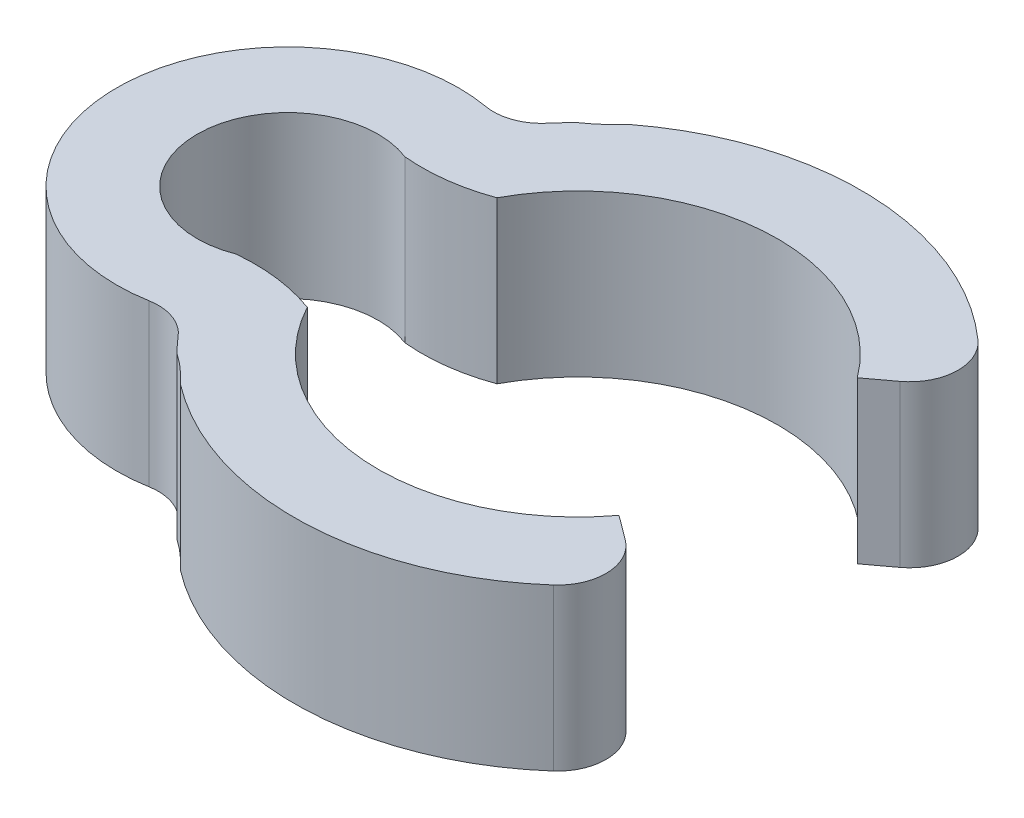
ISO-10303-21;
HEADER;
FILE_DESCRIPTION(('STEP AP214'),'2;1');
FILE_NAME('part.step','',(''),(''),'','','');
FILE_SCHEMA(('AUTOMOTIVE_DESIGN { 1 0 10303 214 1 1 1 1 }'));
ENDSEC;
DATA;
#1=APPLICATION_CONTEXT('core data for automotive mechanical design processes');
#2=APPLICATION_PROTOCOL_DEFINITION('international standard','automotive_design',2000,#1);
#3=PRODUCT_CONTEXT('',#1,'mechanical');
#4=PRODUCT('Part','Part','',(#3));
#5=PRODUCT_RELATED_PRODUCT_CATEGORY('part','',(#4));
#6=PRODUCT_DEFINITION_FORMATION('','',#4);
#7=PRODUCT_DEFINITION_CONTEXT('part definition',#1,'design');
#8=PRODUCT_DEFINITION('design','',#6,#7);
#9=PRODUCT_DEFINITION_SHAPE('','',#8);
#10=(LENGTH_UNIT() NAMED_UNIT(*) SI_UNIT(.MILLI.,.METRE.));
#11=(NAMED_UNIT(*) PLANE_ANGLE_UNIT() SI_UNIT($,.RADIAN.));
#12=(NAMED_UNIT(*) SI_UNIT($,.STERADIAN.) SOLID_ANGLE_UNIT());
#13=UNCERTAINTY_MEASURE_WITH_UNIT(LENGTH_MEASURE(1.E-05),#10,'distance_accuracy_value','');
#14=(GEOMETRIC_REPRESENTATION_CONTEXT(3) GLOBAL_UNCERTAINTY_ASSIGNED_CONTEXT((#13)) GLOBAL_UNIT_ASSIGNED_CONTEXT((#10,
#11,#12)) REPRESENTATION_CONTEXT('',''));
#15=CARTESIAN_POINT('',(0.,0.,0.));
#16=DIRECTION('',(0.,0.,1.));
#17=DIRECTION('',(1.,0.,0.));
#18=AXIS2_PLACEMENT_3D('',#15,#16,#17);
#19=CARTESIAN_POINT('',(-26.2302612035856,10.,-35.2877235474862));
#20=DIRECTION('',(-0.596566142647483,0.,-0.802563914867036));
#21=DIRECTION('',(-0.802563914867036,0.,0.596566142647483));
#22=AXIS2_PLACEMENT_3D('',#19,#20,#21);
#23=PLANE('',#22);
#24=DIRECTION('',(0.802563914867036,0.,-0.596566142647483));
#25=VECTOR('',#24,1.);
#26=CARTESIAN_POINT('',(-26.2302612035856,0.,-35.2877235474862));
#27=LINE('',#26,#25);
#28=CARTESIAN_POINT('',(-56.1272497325228,0.,-13.0645326051934));
#29=VERTEX_POINT('',#28);
#30=CARTESIAN_POINT('',(-54.6139119523254,0.,-14.1894350152458));
#31=VERTEX_POINT('',#30);
#32=EDGE_CURVE('E216',#29,#31,#27,.T.);
#33=ORIENTED_EDGE('',*,*,#32,.T.);
#34=DIRECTION('',(0.,-1.,0.));
#35=VECTOR('',#34,1.);
#36=CARTESIAN_POINT('',(-54.6139119523254,10.,-14.1894350152458));
#37=LINE('',#36,#35);
#38=CARTESIAN_POINT('',(-54.6139119523254,10.,-14.1894350152458));
#39=VERTEX_POINT('',#38);
#40=EDGE_CURVE('E59',#31,#39,#37,.F.);
#41=ORIENTED_EDGE('',*,*,#40,.T.);
#42=DIRECTION('',(0.802563914867036,0.,-0.596566142647483));
#43=VECTOR('',#42,1.);
#44=CARTESIAN_POINT('',(-26.2302612035856,10.,-35.2877235474862));
#45=LINE('',#44,#43);
#46=CARTESIAN_POINT('',(-56.1272497325228,10.,-13.0645326051934));
#47=VERTEX_POINT('',#46);
#48=EDGE_CURVE('E170',#47,#39,#45,.T.);
#49=ORIENTED_EDGE('',*,*,#48,.F.);
#50=DIRECTION('',(0.,-1.,0.));
#51=VECTOR('',#50,1.);
#52=CARTESIAN_POINT('',(-56.1272497325228,10.,-13.0645326051934));
#53=LINE('',#52,#51);
#54=EDGE_CURVE('E215',#47,#29,#53,.T.);
#55=ORIENTED_EDGE('',*,*,#54,.T.);
#56=EDGE_LOOP('',(#33,#41,#49,#55));
#57=FACE_BOUND('',#56,.T.);
#58=ADVANCED_FACE('F36',(#57),#23,.F.);
#59=CARTESIAN_POINT('',(-66.0739101359624,10.,-5.67092728705809));
#60=DIRECTION('',(0.,-1.,0.));
#61=DIRECTION('',(0.,0.,-1.));
#62=AXIS2_PLACEMENT_3D('',#59,#60,#61);
#63=CYLINDRICAL_SURFACE('',#62,17.5909743432081);
#64=CARTESIAN_POINT('',(-66.0739101359624,10.,-5.67092728705809));
#65=DIRECTION('',(0.,1.,0.));
#66=DIRECTION('',(0.,0.,1.));
#67=AXIS2_PLACEMENT_3D('',#64,#65,#66);
#68=CIRCLE('',#67,17.5909743432081);
#69=CARTESIAN_POINT('',(-54.4153333410044,10.,-18.8436250160532));
#70=VERTEX_POINT('',#69);
#71=CARTESIAN_POINT('',(-76.7955892627973,10.,-19.6168218458377));
#72=VERTEX_POINT('',#71);
#73=EDGE_CURVE('E160',#70,#72,#68,.T.);
#74=ORIENTED_EDGE('',*,*,#73,.F.);
#75=DIRECTION('',(0.,-1.,0.));
#76=VECTOR('',#75,1.);
#77=CARTESIAN_POINT('',(-54.4153333410044,10.,-18.8436250160532));
#78=LINE('',#77,#76);
#79=CARTESIAN_POINT('',(-54.4153333410044,0.,-18.8436250160532));
#80=VERTEX_POINT('',#79);
#81=EDGE_CURVE('E289',#70,#80,#78,.T.);
#82=ORIENTED_EDGE('',*,*,#81,.T.);
#83=CARTESIAN_POINT('',(-66.0739101359624,0.,-5.67092728705809));
#84=DIRECTION('',(0.,1.,0.));
#85=DIRECTION('',(0.,0.,1.));
#86=AXIS2_PLACEMENT_3D('',#83,#84,#85);
#87=CIRCLE('',#86,17.5909743432081);
#88=CARTESIAN_POINT('',(-76.7955892627973,0.,-19.6168218458377));
#89=VERTEX_POINT('',#88);
#90=EDGE_CURVE('E176',#80,#89,#87,.T.);
#91=ORIENTED_EDGE('',*,*,#90,.T.);
#92=DIRECTION('',(0.,-1.,0.));
#93=VECTOR('',#92,1.);
#94=CARTESIAN_POINT('',(-76.7955892627973,10.,-19.6168218458377));
#95=LINE('',#94,#93);
#96=EDGE_CURVE('E173',#72,#89,#95,.T.);
#97=ORIENTED_EDGE('',*,*,#96,.F.);
#98=EDGE_LOOP('',(#74,#82,#91,#97));
#99=FACE_BOUND('',#98,.T.);
#100=ADVANCED_FACE('F174',(#99),#63,.T.);
#101=CARTESIAN_POINT('',(-84.2930671877813,10.,-26.356842202746));
#102=DIRECTION('',(0.,-1.,0.));
#103=DIRECTION('',(0.,0.,-1.));
#104=AXIS2_PLACEMENT_3D('',#101,#102,#103);
#105=CYLINDRICAL_SURFACE('',#104,10.0816689911523);
#106=CARTESIAN_POINT('',(-84.2930671877813,0.,-26.356842202746));
#107=DIRECTION('',(0.,1.,0.));
#108=DIRECTION('',(0.,0.,1.));
#109=AXIS2_PLACEMENT_3D('',#106,#107,#108);
#110=CIRCLE('',#109,10.0816689911523);
#111=CARTESIAN_POINT('',(-78.5539627441667,0.,-18.0681312153581));
#112=VERTEX_POINT('',#111);
#113=EDGE_CURVE('E219',#112,#89,#110,.T.);
#114=ORIENTED_EDGE('',*,*,#113,.F.);
#115=DIRECTION('',(0.,-1.,0.));
#116=VECTOR('',#115,1.);
#117=CARTESIAN_POINT('',(-78.5539627441667,10.,-18.0681312153581));
#118=LINE('',#117,#116);
#119=CARTESIAN_POINT('',(-78.5539627441667,10.,-18.0681312153581));
#120=VERTEX_POINT('',#119);
#121=EDGE_CURVE('E181',#120,#112,#118,.T.);
#122=ORIENTED_EDGE('',*,*,#121,.F.);
#123=CARTESIAN_POINT('',(-84.2930671877813,10.,-26.356842202746));
#124=DIRECTION('',(0.,1.,0.));
#125=DIRECTION('',(0.,0.,1.));
#126=AXIS2_PLACEMENT_3D('',#123,#124,#125);
#127=CIRCLE('',#126,10.0816689911523);
#128=EDGE_CURVE('E166',#120,#72,#127,.T.);
#129=ORIENTED_EDGE('',*,*,#128,.T.);
#130=ORIENTED_EDGE('',*,*,#96,.T.);
#131=EDGE_LOOP('',(#114,#122,#129,#130));
#132=FACE_BOUND('',#131,.T.);
#133=ADVANCED_FACE('F183',(#132),#105,.F.);
#134=CARTESIAN_POINT('',(-66.0739101359624,10.,-5.67092728705809));
#135=DIRECTION('',(0.,-1.,0.));
#136=DIRECTION('',(0.,0.,-1.));
#137=AXIS2_PLACEMENT_3D('',#134,#135,#136);
#138=CYLINDRICAL_SURFACE('',#137,17.5909743432081);
#139=CARTESIAN_POINT('',(-66.0739101359624,0.,-5.67092728705809));
#140=DIRECTION('',(0.,1.,0.));
#141=DIRECTION('',(0.,0.,1.));
#142=AXIS2_PLACEMENT_3D('',#139,#140,#141);
#143=CIRCLE('',#142,17.5909743432081);
#144=CARTESIAN_POINT('',(-79.4320728722765,0.,-17.1165319741663));
#145=VERTEX_POINT('',#144);
#146=EDGE_CURVE('E221',#112,#145,#143,.T.);
#147=ORIENTED_EDGE('',*,*,#146,.T.);
#148=DIRECTION('',(0.,-1.,0.));
#149=VECTOR('',#148,1.);
#150=CARTESIAN_POINT('',(-79.4320728722765,10.,-17.1165319741663));
#151=LINE('',#150,#149);
#152=CARTESIAN_POINT('',(-79.4320728722765,10.,-17.1165319741663));
#153=VERTEX_POINT('',#152);
#154=EDGE_CURVE('E275',#145,#153,#151,.F.);
#155=ORIENTED_EDGE('',*,*,#154,.T.);
#156=CARTESIAN_POINT('',(-66.0739101359624,10.,-5.67092728705809));
#157=DIRECTION('',(0.,1.,0.));
#158=DIRECTION('',(0.,0.,1.));
#159=AXIS2_PLACEMENT_3D('',#156,#157,#158);
#160=CIRCLE('',#159,17.5909743432081);
#161=EDGE_CURVE('E185',#120,#153,#160,.T.);
#162=ORIENTED_EDGE('',*,*,#161,.F.);
#163=ORIENTED_EDGE('',*,*,#121,.T.);
#164=EDGE_LOOP('',(#147,#155,#162,#163));
#165=FACE_BOUND('',#164,.T.);
#166=ADVANCED_FACE('F303',(#165),#138,.T.);
#167=CARTESIAN_POINT('',(-84.0849290050507,10.,-5.67092728705809));
#168=DIRECTION('',(0.,-1.,0.));
#169=DIRECTION('',(0.,0.,-1.));
#170=AXIS2_PLACEMENT_3D('',#167,#168,#169);
#171=CYLINDRICAL_SURFACE('',#170,10.6063946818647);
#172=CARTESIAN_POINT('',(-84.0849290050507,0.,-5.67092728705809));
#173=DIRECTION('',(0.,1.,0.));
#174=DIRECTION('',(0.,0.,1.));
#175=AXIS2_PLACEMENT_3D('',#172,#173,#174);
#176=CIRCLE('',#175,10.6063946818647);
#177=CARTESIAN_POINT('',(-82.2337916369375,0.,-16.1145329188245));
#178=VERTEX_POINT('',#177);
#179=CARTESIAN_POINT('',(-82.2337916369375,0.,4.77267834470828));
#180=VERTEX_POINT('',#179);
#181=EDGE_CURVE('E224',#178,#180,#176,.T.);
#182=ORIENTED_EDGE('',*,*,#181,.T.);
#183=DIRECTION('',(0.,-1.,0.));
#184=VECTOR('',#183,1.);
#185=CARTESIAN_POINT('',(-82.2337916369375,10.,4.77267834470828));
#186=LINE('',#185,#184);
#187=CARTESIAN_POINT('',(-82.2337916369375,10.,4.77267834470828));
#188=VERTEX_POINT('',#187);
#189=EDGE_CURVE('E273',#180,#188,#186,.F.);
#190=ORIENTED_EDGE('',*,*,#189,.T.);
#191=CARTESIAN_POINT('',(-84.0849290050507,10.,-5.67092728705809));
#192=DIRECTION('',(0.,1.,0.));
#193=DIRECTION('',(0.,0.,1.));
#194=AXIS2_PLACEMENT_3D('',#191,#192,#193);
#195=CIRCLE('',#194,10.6063946818647);
#196=CARTESIAN_POINT('',(-82.2337916369375,10.,-16.1145329188245));
#197=VERTEX_POINT('',#196);
#198=EDGE_CURVE('E187',#197,#188,#195,.T.);
#199=ORIENTED_EDGE('',*,*,#198,.F.);
#200=DIRECTION('',(0.,-1.,0.));
#201=VECTOR('',#200,1.);
#202=CARTESIAN_POINT('',(-82.2337916369375,10.,-16.1145329188245));
#203=LINE('',#202,#201);
#204=EDGE_CURVE('E270',#197,#178,#203,.T.);
#205=ORIENTED_EDGE('',*,*,#204,.T.);
#206=EDGE_LOOP('',(#182,#190,#199,#205));
#207=FACE_BOUND('',#206,.T.);
#208=ADVANCED_FACE('F309',(#207),#171,.T.);
#209=CARTESIAN_POINT('',(-66.0739101359624,10.,-5.67092728705809));
#210=DIRECTION('',(0.,-1.,0.));
#211=DIRECTION('',(0.,0.,-1.));
#212=AXIS2_PLACEMENT_3D('',#209,#210,#211);
#213=CYLINDRICAL_SURFACE('',#212,17.5909743432081);
#214=CARTESIAN_POINT('',(-66.0739101359624,10.,-5.67092728705809));
#215=DIRECTION('',(0.,1.,0.));
#216=DIRECTION('',(0.,0.,1.));
#217=AXIS2_PLACEMENT_3D('',#214,#215,#216);
#218=CIRCLE('',#217,17.5909743432081);
#219=CARTESIAN_POINT('',(-79.4320728722765,10.,5.77467740005009));
#220=VERTEX_POINT('',#219);
#221=CARTESIAN_POINT('',(-78.5539627441668,10.,6.72627664124188));
#222=VERTEX_POINT('',#221);
#223=EDGE_CURVE('E193',#220,#222,#218,.T.);
#224=ORIENTED_EDGE('',*,*,#223,.F.);
#225=DIRECTION('',(0.,-1.,0.));
#226=VECTOR('',#225,1.);
#227=CARTESIAN_POINT('',(-79.4320728722765,10.,5.7746774000501));
#228=LINE('',#227,#226);
#229=CARTESIAN_POINT('',(-79.4320728722765,0.,5.77467740005009));
#230=VERTEX_POINT('',#229);
#231=EDGE_CURVE('E180',#220,#230,#228,.T.);
#232=ORIENTED_EDGE('',*,*,#231,.T.);
#233=CARTESIAN_POINT('',(-66.0739101359624,0.,-5.67092728705809));
#234=DIRECTION('',(0.,1.,0.));
#235=DIRECTION('',(0.,0.,1.));
#236=AXIS2_PLACEMENT_3D('',#233,#234,#235);
#237=CIRCLE('',#236,17.5909743432081);
#238=CARTESIAN_POINT('',(-78.5539627441668,0.,6.72627664124188));
#239=VERTEX_POINT('',#238);
#240=EDGE_CURVE('E227',#230,#239,#237,.T.);
#241=ORIENTED_EDGE('',*,*,#240,.T.);
#242=DIRECTION('',(0.,-1.,0.));
#243=VECTOR('',#242,1.);
#244=CARTESIAN_POINT('',(-78.5539627441668,10.,6.72627664124188));
#245=LINE('',#244,#243);
#246=EDGE_CURVE('E264',#222,#239,#245,.T.);
#247=ORIENTED_EDGE('',*,*,#246,.F.);
#248=EDGE_LOOP('',(#224,#232,#241,#247));
#249=FACE_BOUND('',#248,.T.);
#250=ADVANCED_FACE('F317',(#249),#213,.T.);
#251=CARTESIAN_POINT('',(-84.2930671877813,10.,15.0149876286298));
#252=DIRECTION('',(0.,-1.,0.));
#253=DIRECTION('',(0.,0.,-1.));
#254=AXIS2_PLACEMENT_3D('',#251,#252,#253);
#255=CYLINDRICAL_SURFACE('',#254,10.0816689911523);
#256=CARTESIAN_POINT('',(-84.2930671877813,0.,15.0149876286298));
#257=DIRECTION('',(0.,1.,0.));
#258=DIRECTION('',(0.,0.,1.));
#259=AXIS2_PLACEMENT_3D('',#256,#257,#258);
#260=CIRCLE('',#259,10.0816689911523);
#261=CARTESIAN_POINT('',(-76.7955892627973,0.,8.27496727172151));
#262=VERTEX_POINT('',#261);
#263=EDGE_CURVE('E229',#239,#262,#260,.F.);
#264=ORIENTED_EDGE('',*,*,#263,.T.);
#265=DIRECTION('',(0.,-1.,0.));
#266=VECTOR('',#265,1.);
#267=CARTESIAN_POINT('',(-76.7955892627973,10.,8.27496727172151));
#268=LINE('',#267,#266);
#269=CARTESIAN_POINT('',(-76.7955892627973,10.,8.27496727172151));
#270=VERTEX_POINT('',#269);
#271=EDGE_CURVE('E261',#270,#262,#268,.T.);
#272=ORIENTED_EDGE('',*,*,#271,.F.);
#273=CARTESIAN_POINT('',(-84.2930671877813,10.,15.0149876286298));
#274=DIRECTION('',(0.,1.,0.));
#275=DIRECTION('',(0.,0.,1.));
#276=AXIS2_PLACEMENT_3D('',#273,#274,#275);
#277=CIRCLE('',#276,10.0816689911523);
#278=EDGE_CURVE('E195',#222,#270,#277,.F.);
#279=ORIENTED_EDGE('',*,*,#278,.F.);
#280=ORIENTED_EDGE('',*,*,#246,.T.);
#281=EDGE_LOOP('',(#264,#272,#279,#280));
#282=FACE_BOUND('',#281,.T.);
#283=ADVANCED_FACE('F323',(#282),#255,.F.);
#284=CARTESIAN_POINT('',(-54.4153333410044,0.,7.50177044193698));
#285=VERTEX_POINT('',#284);
#286=EDGE_CURVE('E230',#262,#285,#237,.T.);
#287=ORIENTED_EDGE('',*,*,#286,.T.);
#288=DIRECTION('',(0.,-1.,0.));
#289=VECTOR('',#288,1.);
#290=CARTESIAN_POINT('',(-54.4153333410044,10.,7.50177044193698));
#291=LINE('',#290,#289);
#292=CARTESIAN_POINT('',(-54.4153333410044,10.,7.50177044193698));
#293=VERTEX_POINT('',#292);
#294=EDGE_CURVE('E284',#285,#293,#291,.F.);
#295=ORIENTED_EDGE('',*,*,#294,.T.);
#296=EDGE_CURVE('E196',#270,#293,#218,.T.);
#297=ORIENTED_EDGE('',*,*,#296,.F.);
#298=ORIENTED_EDGE('',*,*,#271,.T.);
#299=EDGE_LOOP('',(#287,#295,#297,#298));
#300=FACE_BOUND('',#299,.T.);
#301=ADVANCED_FACE('F425',(#300),#213,.T.);
#302=CARTESIAN_POINT('',(-20.7999801818739,10.,27.9823347832626));
#303=DIRECTION('',(0.596566142647483,0.,-0.802563914867036));
#304=DIRECTION('',(-0.802563914867036,0.,-0.596566142647483));
#305=AXIS2_PLACEMENT_3D('',#302,#303,#304);
#306=PLANE('',#305);
#307=DIRECTION('',(0.802563914867036,0.,0.596566142647483));
#308=VECTOR('',#307,1.);
#309=CARTESIAN_POINT('',(-20.7999801818739,10.,27.9823347832626));
#310=LINE('',#309,#308);
#311=CARTESIAN_POINT('',(-56.1272497325228,10.,1.72267803107722));
#312=VERTEX_POINT('',#311);
#313=CARTESIAN_POINT('',(-54.6139119523254,10.,2.84758044112965));
#314=VERTEX_POINT('',#313);
#315=EDGE_CURVE('E198',#312,#314,#310,.T.);
#316=ORIENTED_EDGE('',*,*,#315,.T.);
#317=DIRECTION('',(0.,1.,0.));
#318=VECTOR('',#317,1.);
#319=CARTESIAN_POINT('',(-54.6139119523254,0.,2.84758044112965));
#320=LINE('',#319,#318);
#321=CARTESIAN_POINT('',(-54.6139119523254,0.,2.84758044112965));
#322=VERTEX_POINT('',#321);
#323=EDGE_CURVE('E277',#314,#322,#320,.F.);
#324=ORIENTED_EDGE('',*,*,#323,.T.);
#325=DIRECTION('',(0.802563914867036,0.,0.596566142647483));
#326=VECTOR('',#325,1.);
#327=CARTESIAN_POINT('',(-20.7999801818739,0.,27.9823347832626));
#328=LINE('',#327,#326);
#329=CARTESIAN_POINT('',(-56.1272497325228,0.,1.72267803107722));
#330=VERTEX_POINT('',#329);
#331=EDGE_CURVE('E232',#330,#322,#328,.T.);
#332=ORIENTED_EDGE('',*,*,#331,.F.);
#333=DIRECTION('',(0.,-1.,0.));
#334=VECTOR('',#333,1.);
#335=CARTESIAN_POINT('',(-56.1272497325228,10.,1.72267803107722));
#336=LINE('',#335,#334);
#337=EDGE_CURVE('E259',#312,#330,#336,.T.);
#338=ORIENTED_EDGE('',*,*,#337,.F.);
#339=EDGE_LOOP('',(#316,#324,#332,#338));
#340=FACE_BOUND('',#339,.T.);
#341=ADVANCED_FACE('F334',(#340),#306,.T.);
#342=CARTESIAN_POINT('',(-66.0739101359624,10.,-5.67092728705809));
#343=DIRECTION('',(0.,-1.,0.));
#344=DIRECTION('',(0.,0.,-1.));
#345=AXIS2_PLACEMENT_3D('',#342,#343,#344);
#346=CYLINDRICAL_SURFACE('',#345,12.3936053181353);
#347=CARTESIAN_POINT('',(-66.0739101359624,0.,-5.67092728705809));
#348=DIRECTION('',(0.,1.,0.));
#349=DIRECTION('',(0.,0.,1.));
#350=AXIS2_PLACEMENT_3D('',#347,#348,#349);
#351=CIRCLE('',#350,12.3936053181353);
#352=CARTESIAN_POINT('',(-76.9812163121651,0.,0.213979233888641));
#353=VERTEX_POINT('',#352);
#354=EDGE_CURVE('E235',#353,#330,#351,.T.);
#355=ORIENTED_EDGE('',*,*,#354,.F.);
#356=DIRECTION('',(0.,-1.,0.));
#357=VECTOR('',#356,1.);
#358=CARTESIAN_POINT('',(-76.9812163121651,10.,0.213979233888641));
#359=LINE('',#358,#357);
#360=CARTESIAN_POINT('',(-76.9812163121651,10.,0.213979233888641));
#361=VERTEX_POINT('',#360);
#362=EDGE_CURVE('E257',#361,#353,#359,.T.);
#363=ORIENTED_EDGE('',*,*,#362,.F.);
#364=CARTESIAN_POINT('',(-66.0739101359624,10.,-5.67092728705809));
#365=DIRECTION('',(0.,1.,0.));
#366=DIRECTION('',(0.,0.,1.));
#367=AXIS2_PLACEMENT_3D('',#364,#365,#366);
#368=CIRCLE('',#367,12.3936053181353);
#369=EDGE_CURVE('E201',#361,#312,#368,.T.);
#370=ORIENTED_EDGE('',*,*,#369,.T.);
#371=ORIENTED_EDGE('',*,*,#337,.T.);
#372=EDGE_LOOP('',(#355,#363,#370,#371));
#373=FACE_BOUND('',#372,.T.);
#374=ADVANCED_FACE('F340',(#373),#346,.F.);
#375=CARTESIAN_POINT('',(-80.9464097284021,10.,11.057073707388));
#376=DIRECTION('',(0.,-1.,0.));
#377=DIRECTION('',(0.,0.,-1.));
#378=AXIS2_PLACEMENT_3D('',#375,#376,#377);
#379=CYLINDRICAL_SURFACE('',#378,11.5453651561742);
#380=CARTESIAN_POINT('',(-80.9464097284021,0.,11.057073707388));
#381=DIRECTION('',(0.,1.,0.));
#382=DIRECTION('',(0.,0.,1.));
#383=AXIS2_PLACEMENT_3D('',#380,#381,#382);
#384=CIRCLE('',#383,11.5453651561742);
#385=CARTESIAN_POINT('',(-82.0487205152693,0.,-0.435548600795535));
#386=VERTEX_POINT('',#385);
#387=EDGE_CURVE('E238',#386,#353,#384,.F.);
#388=ORIENTED_EDGE('',*,*,#387,.F.);
#389=DIRECTION('',(0.,-1.,0.));
#390=VECTOR('',#389,1.);
#391=CARTESIAN_POINT('',(-82.0487205152693,10.,-0.435548600795535));
#392=LINE('',#391,#390);
#393=CARTESIAN_POINT('',(-82.0487205152693,10.,-0.435548600795535));
#394=VERTEX_POINT('',#393);
#395=EDGE_CURVE('E255',#394,#386,#392,.T.);
#396=ORIENTED_EDGE('',*,*,#395,.F.);
#397=CARTESIAN_POINT('',(-80.9464097284021,10.,11.057073707388));
#398=DIRECTION('',(0.,1.,0.));
#399=DIRECTION('',(0.,0.,1.));
#400=AXIS2_PLACEMENT_3D('',#397,#398,#399);
#401=CIRCLE('',#400,11.5453651561742);
#402=EDGE_CURVE('E204',#394,#361,#401,.F.);
#403=ORIENTED_EDGE('',*,*,#402,.T.);
#404=ORIENTED_EDGE('',*,*,#362,.T.);
#405=EDGE_LOOP('',(#388,#396,#403,#404));
#406=FACE_BOUND('',#405,.T.);
#407=ADVANCED_FACE('F345',(#406),#379,.T.);
#408=CARTESIAN_POINT('',(-84.0849290050507,10.,-5.67092728705809));
#409=DIRECTION('',(0.,-1.,0.));
#410=DIRECTION('',(0.,0.,-1.));
#411=AXIS2_PLACEMENT_3D('',#408,#409,#410);
#412=CYLINDRICAL_SURFACE('',#411,5.61741355095296);
#413=CARTESIAN_POINT('',(-84.0849290050507,0.,-5.67092728705809));
#414=DIRECTION('',(0.,1.,0.));
#415=DIRECTION('',(0.,0.,1.));
#416=AXIS2_PLACEMENT_3D('',#413,#414,#415);
#417=CIRCLE('',#416,5.61741355095296);
#418=CARTESIAN_POINT('',(-82.0487205152693,0.,-10.9063059733207));
#419=VERTEX_POINT('',#418);
#420=EDGE_CURVE('E241',#419,#386,#417,.T.);
#421=ORIENTED_EDGE('',*,*,#420,.F.);
#422=DIRECTION('',(0.,-1.,0.));
#423=VECTOR('',#422,1.);
#424=CARTESIAN_POINT('',(-82.0487205152693,10.,-10.9063059733207));
#425=LINE('',#424,#423);
#426=CARTESIAN_POINT('',(-82.0487205152693,10.,-10.9063059733207));
#427=VERTEX_POINT('',#426);
#428=EDGE_CURVE('E253',#427,#419,#425,.T.);
#429=ORIENTED_EDGE('',*,*,#428,.F.);
#430=CARTESIAN_POINT('',(-84.0849290050507,10.,-5.67092728705809));
#431=DIRECTION('',(0.,1.,0.));
#432=DIRECTION('',(0.,0.,1.));
#433=AXIS2_PLACEMENT_3D('',#430,#431,#432);
#434=CIRCLE('',#433,5.61741355095296);
#435=EDGE_CURVE('E207',#427,#394,#434,.T.);
#436=ORIENTED_EDGE('',*,*,#435,.T.);
#437=ORIENTED_EDGE('',*,*,#395,.T.);
#438=EDGE_LOOP('',(#421,#429,#436,#437));
#439=FACE_BOUND('',#438,.T.);
#440=ADVANCED_FACE('F348',(#439),#412,.F.);
#441=CARTESIAN_POINT('',(-80.9464097284021,10.,-22.3989282815042));
#442=DIRECTION('',(0.,-1.,0.));
#443=DIRECTION('',(0.,0.,-1.));
#444=AXIS2_PLACEMENT_3D('',#441,#442,#443);
#445=CYLINDRICAL_SURFACE('',#444,11.5453651561742);
#446=CARTESIAN_POINT('',(-80.9464097284021,0.,-22.3989282815042));
#447=DIRECTION('',(0.,1.,0.));
#448=DIRECTION('',(0.,0.,1.));
#449=AXIS2_PLACEMENT_3D('',#446,#447,#448);
#450=CIRCLE('',#449,11.5453651561742);
#451=CARTESIAN_POINT('',(-76.9812163121651,0.,-11.5558338080048));
#452=VERTEX_POINT('',#451);
#453=EDGE_CURVE('E244',#419,#452,#450,.T.);
#454=ORIENTED_EDGE('',*,*,#453,.T.);
#455=DIRECTION('',(0.,-1.,0.));
#456=VECTOR('',#455,1.);
#457=CARTESIAN_POINT('',(-76.9812163121651,10.,-11.5558338080048));
#458=LINE('',#457,#456);
#459=CARTESIAN_POINT('',(-76.9812163121651,10.,-11.5558338080048));
#460=VERTEX_POINT('',#459);
#461=EDGE_CURVE('E251',#460,#452,#458,.T.);
#462=ORIENTED_EDGE('',*,*,#461,.F.);
#463=CARTESIAN_POINT('',(-80.9464097284021,10.,-22.3989282815042));
#464=DIRECTION('',(0.,1.,0.));
#465=DIRECTION('',(0.,0.,1.));
#466=AXIS2_PLACEMENT_3D('',#463,#464,#465);
#467=CIRCLE('',#466,11.5453651561742);
#468=EDGE_CURVE('E210',#427,#460,#467,.T.);
#469=ORIENTED_EDGE('',*,*,#468,.F.);
#470=ORIENTED_EDGE('',*,*,#428,.T.);
#471=EDGE_LOOP('',(#454,#462,#469,#470));
#472=FACE_BOUND('',#471,.T.);
#473=ADVANCED_FACE('F353',(#472),#445,.T.);
#474=CARTESIAN_POINT('',(-66.0739101359624,10.,-5.67092728705809));
#475=DIRECTION('',(0.,-1.,0.));
#476=DIRECTION('',(0.,0.,-1.));
#477=AXIS2_PLACEMENT_3D('',#474,#475,#476);
#478=CYLINDRICAL_SURFACE('',#477,12.3936053181353);
#479=CARTESIAN_POINT('',(-66.0739101359624,0.,-5.67092728705809));
#480=DIRECTION('',(0.,1.,0.));
#481=DIRECTION('',(0.,0.,1.));
#482=AXIS2_PLACEMENT_3D('',#479,#480,#481);
#483=CIRCLE('',#482,12.3936053181353);
#484=EDGE_CURVE('E247',#29,#452,#483,.T.);
#485=ORIENTED_EDGE('',*,*,#484,.F.);
#486=ORIENTED_EDGE('',*,*,#54,.F.);
#487=CARTESIAN_POINT('',(-66.0739101359624,10.,-5.67092728705809));
#488=DIRECTION('',(0.,1.,0.));
#489=DIRECTION('',(0.,0.,1.));
#490=AXIS2_PLACEMENT_3D('',#487,#488,#489);
#491=CIRCLE('',#490,12.3936053181353);
#492=EDGE_CURVE('E212',#47,#460,#491,.T.);
#493=ORIENTED_EDGE('',*,*,#492,.T.);
#494=ORIENTED_EDGE('',*,*,#461,.T.);
#495=EDGE_LOOP('',(#485,#486,#493,#494));
#496=FACE_BOUND('',#495,.T.);
#497=ADVANCED_FACE('F357',(#496),#478,.F.);
#498=CARTESIAN_POINT('',(0.,10.,0.));
#499=DIRECTION('',(0.,1.,0.));
#500=DIRECTION('',(0.,0.,1.));
#501=AXIS2_PLACEMENT_3D('',#498,#499,#500);
#502=PLANE('',#501);
#503=ORIENTED_EDGE('',*,*,#296,.T.);
#504=CARTESIAN_POINT('',(-56.4036103802679,10.,5.25527218573076));
#505=DIRECTION('',(0.,1.,0.));
#506=DIRECTION('',(0.,0.,1.));
#507=AXIS2_PLACEMENT_3D('',#504,#505,#506);
#508=CIRCLE('',#507,3.);
#509=EDGE_CURVE('E287',#293,#314,#508,.T.);
#510=ORIENTED_EDGE('',*,*,#509,.T.);
#511=ORIENTED_EDGE('',*,*,#315,.F.);
#512=ORIENTED_EDGE('',*,*,#369,.F.);
#513=ORIENTED_EDGE('',*,*,#402,.F.);
#514=ORIENTED_EDGE('',*,*,#435,.F.);
#515=ORIENTED_EDGE('',*,*,#468,.T.);
#516=ORIENTED_EDGE('',*,*,#492,.F.);
#517=ORIENTED_EDGE('',*,*,#48,.T.);
#518=CARTESIAN_POINT('',(-56.4036103802679,10.,-16.597126759847));
#519=DIRECTION('',(0.,1.,0.));
#520=DIRECTION('',(0.,0.,1.));
#521=AXIS2_PLACEMENT_3D('',#518,#519,#520);
#522=CIRCLE('',#521,3.);
#523=EDGE_CURVE('E51',#39,#70,#522,.T.);
#524=ORIENTED_EDGE('',*,*,#523,.T.);
#525=ORIENTED_EDGE('',*,*,#73,.T.);
#526=ORIENTED_EDGE('',*,*,#128,.F.);
#527=ORIENTED_EDGE('',*,*,#161,.T.);
#528=CARTESIAN_POINT('',(-81.7102007023257,10.,-19.0684883235644));
#529=DIRECTION('',(0.,1.,0.));
#530=DIRECTION('',(0.,0.,1.));
#531=AXIS2_PLACEMENT_3D('',#528,#529,#530);
#532=CIRCLE('',#531,3.);
#533=EDGE_CURVE('E11',#153,#197,#532,.F.);
#534=ORIENTED_EDGE('',*,*,#533,.T.);
#535=ORIENTED_EDGE('',*,*,#198,.T.);
#536=CARTESIAN_POINT('',(-81.7102007023257,10.,7.72663374944822));
#537=DIRECTION('',(0.,1.,0.));
#538=DIRECTION('',(0.,0.,1.));
#539=AXIS2_PLACEMENT_3D('',#536,#537,#538);
#540=CIRCLE('',#539,3.);
#541=EDGE_CURVE('E294',#188,#220,#540,.F.);
#542=ORIENTED_EDGE('',*,*,#541,.T.);
#543=ORIENTED_EDGE('',*,*,#223,.T.);
#544=ORIENTED_EDGE('',*,*,#278,.T.);
#545=EDGE_LOOP('',(#503,#510,#511,#512,#513,#514,#515,#516,#517,#524,#525,#526,#527,#534,#535,
#542,#543,#544));
#546=FACE_BOUND('',#545,.T.);
#547=ADVANCED_FACE('F163',(#546),#502,.T.);
#548=CARTESIAN_POINT('',(0.,0.,0.));
#549=DIRECTION('',(0.,1.,0.));
#550=DIRECTION('',(0.,0.,1.));
#551=AXIS2_PLACEMENT_3D('',#548,#549,#550);
#552=PLANE('',#551);
#553=ORIENTED_EDGE('',*,*,#331,.T.);
#554=CARTESIAN_POINT('',(-56.4036103802679,0.,5.25527218573076));
#555=DIRECTION('',(0.,1.,0.));
#556=DIRECTION('',(0.,0.,1.));
#557=AXIS2_PLACEMENT_3D('',#554,#555,#556);
#558=CIRCLE('',#557,3.);
#559=EDGE_CURVE('E282',#322,#285,#558,.F.);
#560=ORIENTED_EDGE('',*,*,#559,.T.);
#561=ORIENTED_EDGE('',*,*,#286,.F.);
#562=ORIENTED_EDGE('',*,*,#263,.F.);
#563=ORIENTED_EDGE('',*,*,#240,.F.);
#564=CARTESIAN_POINT('',(-81.7102007023257,0.,7.72663374944822));
#565=DIRECTION('',(0.,1.,0.));
#566=DIRECTION('',(0.,0.,1.));
#567=AXIS2_PLACEMENT_3D('',#564,#565,#566);
#568=CIRCLE('',#567,3.);
#569=EDGE_CURVE('E292',#230,#180,#568,.T.);
#570=ORIENTED_EDGE('',*,*,#569,.T.);
#571=ORIENTED_EDGE('',*,*,#181,.F.);
#572=CARTESIAN_POINT('',(-81.7102007023257,0.,-19.0684883235644));
#573=DIRECTION('',(0.,1.,0.));
#574=DIRECTION('',(0.,0.,1.));
#575=AXIS2_PLACEMENT_3D('',#572,#573,#574);
#576=CIRCLE('',#575,3.);
#577=EDGE_CURVE('E44',#178,#145,#576,.T.);
#578=ORIENTED_EDGE('',*,*,#577,.T.);
#579=ORIENTED_EDGE('',*,*,#146,.F.);
#580=ORIENTED_EDGE('',*,*,#113,.T.);
#581=ORIENTED_EDGE('',*,*,#90,.F.);
#582=CARTESIAN_POINT('',(-56.4036103802679,0.,-16.597126759847));
#583=DIRECTION('',(0.,1.,0.));
#584=DIRECTION('',(0.,0.,1.));
#585=AXIS2_PLACEMENT_3D('',#582,#583,#584);
#586=CIRCLE('',#585,3.);
#587=EDGE_CURVE('E280',#80,#31,#586,.F.);
#588=ORIENTED_EDGE('',*,*,#587,.T.);
#589=ORIENTED_EDGE('',*,*,#32,.F.);
#590=ORIENTED_EDGE('',*,*,#484,.T.);
#591=ORIENTED_EDGE('',*,*,#453,.F.);
#592=ORIENTED_EDGE('',*,*,#420,.T.);
#593=ORIENTED_EDGE('',*,*,#387,.T.);
#594=ORIENTED_EDGE('',*,*,#354,.T.);
#595=EDGE_LOOP('',(#553,#560,#561,#562,#563,#570,#571,#578,#579,#580,#581,#588,#589,#590,#591,
#592,#593,#594));
#596=FACE_BOUND('',#595,.T.);
#597=ADVANCED_FACE('F298',(#596),#552,.F.);
#598=CARTESIAN_POINT('',(-81.7102007023257,10.,7.72663374944822));
#599=DIRECTION('',(0.,1.,0.));
#600=DIRECTION('',(0.,0.,1.));
#601=AXIS2_PLACEMENT_3D('',#598,#599,#600);
#602=CYLINDRICAL_SURFACE('',#601,3.);
#603=ORIENTED_EDGE('',*,*,#541,.F.);
#604=ORIENTED_EDGE('',*,*,#189,.F.);
#605=ORIENTED_EDGE('',*,*,#569,.F.);
#606=ORIENTED_EDGE('',*,*,#231,.F.);
#607=EDGE_LOOP('',(#603,#604,#605,#606));
#608=FACE_BOUND('',#607,.T.);
#609=ADVANCED_FACE('F312',(#608),#602,.F.);
#610=CARTESIAN_POINT('',(-81.7102007023257,10.,-19.0684883235644));
#611=DIRECTION('',(0.,1.,0.));
#612=DIRECTION('',(0.,0.,1.));
#613=AXIS2_PLACEMENT_3D('',#610,#611,#612);
#614=CYLINDRICAL_SURFACE('',#613,3.);
#615=ORIENTED_EDGE('',*,*,#533,.F.);
#616=ORIENTED_EDGE('',*,*,#154,.F.);
#617=ORIENTED_EDGE('',*,*,#577,.F.);
#618=ORIENTED_EDGE('',*,*,#204,.F.);
#619=EDGE_LOOP('',(#615,#616,#617,#618));
#620=FACE_BOUND('',#619,.T.);
#621=ADVANCED_FACE('F305',(#620),#614,.F.);
#622=CARTESIAN_POINT('',(-56.4036103802679,10.,5.25527218573076));
#623=DIRECTION('',(0.,-1.,0.));
#624=DIRECTION('',(0.,0.,-1.));
#625=AXIS2_PLACEMENT_3D('',#622,#623,#624);
#626=CYLINDRICAL_SURFACE('',#625,3.);
#627=ORIENTED_EDGE('',*,*,#509,.F.);
#628=ORIENTED_EDGE('',*,*,#294,.F.);
#629=ORIENTED_EDGE('',*,*,#559,.F.);
#630=ORIENTED_EDGE('',*,*,#323,.F.);
#631=EDGE_LOOP('',(#627,#628,#629,#630));
#632=FACE_BOUND('',#631,.T.);
#633=ADVANCED_FACE('F331',(#632),#626,.T.);
#634=CARTESIAN_POINT('',(-56.4036103802679,10.,-16.597126759847));
#635=DIRECTION('',(0.,-1.,0.));
#636=DIRECTION('',(0.,0.,-1.));
#637=AXIS2_PLACEMENT_3D('',#634,#635,#636);
#638=CYLINDRICAL_SURFACE('',#637,3.);
#639=ORIENTED_EDGE('',*,*,#523,.F.);
#640=ORIENTED_EDGE('',*,*,#40,.F.);
#641=ORIENTED_EDGE('',*,*,#587,.F.);
#642=ORIENTED_EDGE('',*,*,#81,.F.);
#643=EDGE_LOOP('',(#639,#640,#641,#642));
#644=FACE_BOUND('',#643,.T.);
#645=ADVANCED_FACE('F38',(#644),#638,.T.);
#646=CLOSED_SHELL('',(#58,#100,#133,#166,#208,#250,#283,#301,#341,#374,#407,#440,#473,#497,#547,
#597,#609,#621,#633,#645));
#647=MANIFOLD_SOLID_BREP('B2',#646);
#648=ADVANCED_BREP_SHAPE_REPRESENTATION('',(#18,#647),#14);
#649=SHAPE_DEFINITION_REPRESENTATION(#9,#648);
ENDSEC;
END-ISO-10303-21;
